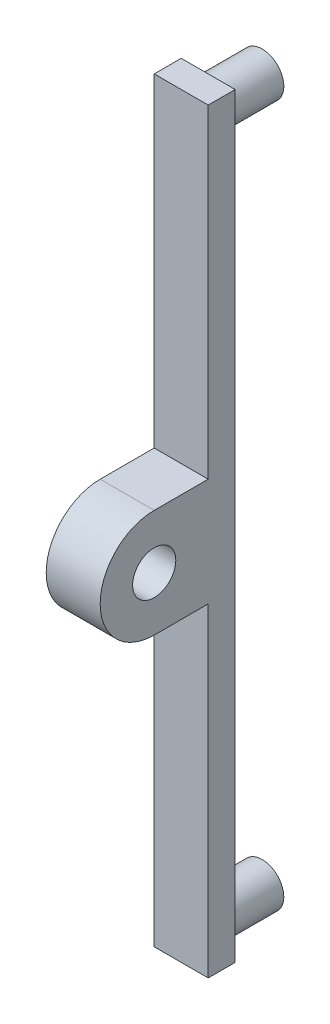
ISO-10303-21;
HEADER;
FILE_DESCRIPTION(('STEP AP214'),'2;1');
FILE_NAME('part.step','',(''),(''),'','','');
FILE_SCHEMA(('AUTOMOTIVE_DESIGN { 1 0 10303 214 1 1 1 1 }'));
ENDSEC;
DATA;
#1=APPLICATION_CONTEXT('core data for automotive mechanical design processes');
#2=APPLICATION_PROTOCOL_DEFINITION('international standard','automotive_design',2000,#1);
#3=PRODUCT_CONTEXT('',#1,'mechanical');
#4=PRODUCT('Part','Part','',(#3));
#5=PRODUCT_RELATED_PRODUCT_CATEGORY('part','',(#4));
#6=PRODUCT_DEFINITION_FORMATION('','',#4);
#7=PRODUCT_DEFINITION_CONTEXT('part definition',#1,'design');
#8=PRODUCT_DEFINITION('design','',#6,#7);
#9=PRODUCT_DEFINITION_SHAPE('','',#8);
#10=(LENGTH_UNIT() NAMED_UNIT(*) SI_UNIT(.MILLI.,.METRE.));
#11=(NAMED_UNIT(*) PLANE_ANGLE_UNIT() SI_UNIT($,.RADIAN.));
#12=(NAMED_UNIT(*) SI_UNIT($,.STERADIAN.) SOLID_ANGLE_UNIT());
#13=UNCERTAINTY_MEASURE_WITH_UNIT(LENGTH_MEASURE(1.E-05),#10,'distance_accuracy_value','');
#14=(GEOMETRIC_REPRESENTATION_CONTEXT(3) GLOBAL_UNCERTAINTY_ASSIGNED_CONTEXT((#13)) GLOBAL_UNIT_ASSIGNED_CONTEXT((#10,
#11,#12)) REPRESENTATION_CONTEXT('',''));
#15=CARTESIAN_POINT('',(0.,0.,0.));
#16=DIRECTION('',(0.,0.,1.));
#17=DIRECTION('',(1.,0.,0.));
#18=AXIS2_PLACEMENT_3D('',#15,#16,#17);
#19=CARTESIAN_POINT('',(10.,10.,0.));
#20=DIRECTION('',(0.,1.,0.));
#21=DIRECTION('',(0.,0.,1.));
#22=AXIS2_PLACEMENT_3D('',#19,#20,#21);
#23=PLANE('',#22);
#24=DIRECTION('',(0.,0.,-1.));
#25=VECTOR('',#24,1.);
#26=CARTESIAN_POINT('',(0.,10.,0.));
#27=LINE('',#26,#25);
#28=CARTESIAN_POINT('',(0.,10.,0.));
#29=VERTEX_POINT('',#28);
#30=CARTESIAN_POINT('',(0.,10.,-10.));
#31=VERTEX_POINT('',#30);
#32=EDGE_CURVE('E132',#29,#31,#27,.T.);
#33=ORIENTED_EDGE('',*,*,#32,.F.);
#34=DIRECTION('',(-1.,0.,0.));
#35=VECTOR('',#34,1.);
#36=CARTESIAN_POINT('',(10.,10.,0.));
#37=LINE('',#36,#35);
#38=CARTESIAN_POINT('',(10.,10.,0.));
#39=VERTEX_POINT('',#38);
#40=EDGE_CURVE('E11',#39,#29,#37,.T.);
#41=ORIENTED_EDGE('',*,*,#40,.F.);
#42=DIRECTION('',(0.,0.,-1.));
#43=VECTOR('',#42,1.);
#44=CARTESIAN_POINT('',(10.,10.,0.));
#45=LINE('',#44,#43);
#46=CARTESIAN_POINT('',(10.,10.,-10.));
#47=VERTEX_POINT('',#46);
#48=EDGE_CURVE('E237',#39,#47,#45,.T.);
#49=ORIENTED_EDGE('',*,*,#48,.T.);
#50=DIRECTION('',(-1.,0.,0.));
#51=VECTOR('',#50,1.);
#52=CARTESIAN_POINT('',(10.,10.,-10.));
#53=LINE('',#52,#51);
#54=EDGE_CURVE('E86',#47,#31,#53,.T.);
#55=ORIENTED_EDGE('',*,*,#54,.T.);
#56=EDGE_LOOP('',(#33,#41,#49,#55));
#57=FACE_BOUND('',#56,.T.);
#58=ADVANCED_FACE('F35',(#57),#23,.T.);
#59=CARTESIAN_POINT('',(10.,0.,0.));
#60=DIRECTION('',(-1.,0.,0.));
#61=DIRECTION('',(0.,0.,1.));
#62=AXIS2_PLACEMENT_3D('',#59,#60,#61);
#63=CYLINDRICAL_SURFACE('',#62,10.);
#64=CARTESIAN_POINT('',(0.,0.,0.));
#65=DIRECTION('',(1.,0.,0.));
#66=DIRECTION('',(0.,0.,-1.));
#67=AXIS2_PLACEMENT_3D('',#64,#65,#66);
#68=CIRCLE('',#67,10.);
#69=CARTESIAN_POINT('',(0.,-10.,0.));
#70=VERTEX_POINT('',#69);
#71=EDGE_CURVE('E136',#29,#70,#68,.T.);
#72=ORIENTED_EDGE('',*,*,#71,.T.);
#73=DIRECTION('',(-1.,0.,0.));
#74=VECTOR('',#73,1.);
#75=CARTESIAN_POINT('',(10.,-10.,0.));
#76=LINE('',#75,#74);
#77=CARTESIAN_POINT('',(10.,-10.,0.));
#78=VERTEX_POINT('',#77);
#79=EDGE_CURVE('E44',#78,#70,#76,.T.);
#80=ORIENTED_EDGE('',*,*,#79,.F.);
#81=CARTESIAN_POINT('',(10.,0.,0.));
#82=DIRECTION('',(1.,0.,0.));
#83=DIRECTION('',(0.,0.,-1.));
#84=AXIS2_PLACEMENT_3D('',#81,#82,#83);
#85=CIRCLE('',#84,10.);
#86=EDGE_CURVE('E239',#39,#78,#85,.T.);
#87=ORIENTED_EDGE('',*,*,#86,.F.);
#88=ORIENTED_EDGE('',*,*,#40,.T.);
#89=EDGE_LOOP('',(#72,#80,#87,#88));
#90=FACE_BOUND('',#89,.T.);
#91=ADVANCED_FACE('F172',(#90),#63,.T.);
#92=CARTESIAN_POINT('',(10.,-10.,0.));
#93=DIRECTION('',(0.,1.,0.));
#94=DIRECTION('',(0.,0.,1.));
#95=AXIS2_PLACEMENT_3D('',#92,#93,#94);
#96=PLANE('',#95);
#97=DIRECTION('',(0.,0.,-1.));
#98=VECTOR('',#97,1.);
#99=CARTESIAN_POINT('',(0.,-10.,0.));
#100=LINE('',#99,#98);
#101=CARTESIAN_POINT('',(0.,-10.,-10.));
#102=VERTEX_POINT('',#101);
#103=EDGE_CURVE('E139',#70,#102,#100,.T.);
#104=ORIENTED_EDGE('',*,*,#103,.T.);
#105=DIRECTION('',(-1.,0.,0.));
#106=VECTOR('',#105,1.);
#107=CARTESIAN_POINT('',(10.,-10.,-10.));
#108=LINE('',#107,#106);
#109=CARTESIAN_POINT('',(10.,-10.,-10.));
#110=VERTEX_POINT('',#109);
#111=EDGE_CURVE('E160',#110,#102,#108,.T.);
#112=ORIENTED_EDGE('',*,*,#111,.F.);
#113=DIRECTION('',(0.,0.,-1.));
#114=VECTOR('',#113,1.);
#115=CARTESIAN_POINT('',(10.,-10.,0.));
#116=LINE('',#115,#114);
#117=EDGE_CURVE('E168',#78,#110,#116,.T.);
#118=ORIENTED_EDGE('',*,*,#117,.F.);
#119=ORIENTED_EDGE('',*,*,#79,.T.);
#120=EDGE_LOOP('',(#104,#112,#118,#119));
#121=FACE_BOUND('',#120,.T.);
#122=ADVANCED_FACE('F165',(#121),#96,.F.);
#123=CARTESIAN_POINT('',(10.,0.,-10.));
#124=DIRECTION('',(0.,0.,-1.));
#125=DIRECTION('',(-1.,0.,0.));
#126=AXIS2_PLACEMENT_3D('',#123,#124,#125);
#127=PLANE('',#126);
#128=DIRECTION('',(0.,-1.,0.));
#129=VECTOR('',#128,1.);
#130=CARTESIAN_POINT('',(0.,0.,-10.));
#131=LINE('',#130,#129);
#132=CARTESIAN_POINT('',(0.,-70.,-10.));
#133=VERTEX_POINT('',#132);
#134=EDGE_CURVE('E142',#102,#133,#131,.T.);
#135=ORIENTED_EDGE('',*,*,#134,.T.);
#136=DIRECTION('',(-1.,0.,0.));
#137=VECTOR('',#136,1.);
#138=CARTESIAN_POINT('',(10.,-70.,-10.));
#139=LINE('',#138,#137);
#140=CARTESIAN_POINT('',(10.,-70.,-10.));
#141=VERTEX_POINT('',#140);
#142=EDGE_CURVE('E157',#141,#133,#139,.T.);
#143=ORIENTED_EDGE('',*,*,#142,.F.);
#144=DIRECTION('',(0.,-1.,0.));
#145=VECTOR('',#144,1.);
#146=CARTESIAN_POINT('',(10.,0.,-10.));
#147=LINE('',#146,#145);
#148=EDGE_CURVE('E242',#110,#141,#147,.T.);
#149=ORIENTED_EDGE('',*,*,#148,.F.);
#150=ORIENTED_EDGE('',*,*,#111,.T.);
#151=EDGE_LOOP('',(#135,#143,#149,#150));
#152=FACE_BOUND('',#151,.T.);
#153=ADVANCED_FACE('F183',(#152),#127,.F.);
#154=CARTESIAN_POINT('',(10.,-70.,0.));
#155=DIRECTION('',(0.,1.,0.));
#156=DIRECTION('',(0.,0.,1.));
#157=AXIS2_PLACEMENT_3D('',#154,#155,#156);
#158=PLANE('',#157);
#159=DIRECTION('',(0.,0.,-1.));
#160=VECTOR('',#159,1.);
#161=CARTESIAN_POINT('',(0.,-70.,0.));
#162=LINE('',#161,#160);
#163=CARTESIAN_POINT('',(0.,-70.,-15.));
#164=VERTEX_POINT('',#163);
#165=EDGE_CURVE('E145',#133,#164,#162,.T.);
#166=ORIENTED_EDGE('',*,*,#165,.T.);
#167=DIRECTION('',(-1.,0.,0.));
#168=VECTOR('',#167,1.);
#169=CARTESIAN_POINT('',(10.,-70.,-15.));
#170=LINE('',#169,#168);
#171=CARTESIAN_POINT('',(10.,-70.,-15.));
#172=VERTEX_POINT('',#171);
#173=EDGE_CURVE('E116',#172,#164,#170,.T.);
#174=ORIENTED_EDGE('',*,*,#173,.F.);
#175=DIRECTION('',(0.,0.,-1.));
#176=VECTOR('',#175,1.);
#177=CARTESIAN_POINT('',(10.,-70.,0.));
#178=LINE('',#177,#176);
#179=EDGE_CURVE('E121',#141,#172,#178,.T.);
#180=ORIENTED_EDGE('',*,*,#179,.F.);
#181=ORIENTED_EDGE('',*,*,#142,.T.);
#182=EDGE_LOOP('',(#166,#174,#180,#181));
#183=FACE_BOUND('',#182,.T.);
#184=ADVANCED_FACE('F186',(#183),#158,.F.);
#185=CARTESIAN_POINT('',(10.,0.,-15.));
#186=DIRECTION('',(0.,0.,-1.));
#187=DIRECTION('',(0.,1.,0.));
#188=AXIS2_PLACEMENT_3D('',#185,#186,#187);
#189=PLANE('',#188);
#190=CARTESIAN_POINT('',(4.99999999999998,-65.,-15.));
#191=DIRECTION('',(0.,0.,-1.));
#192=DIRECTION('',(1.,0.,0.));
#193=AXIS2_PLACEMENT_3D('',#190,#191,#192);
#194=CIRCLE('',#193,4.);
#195=CARTESIAN_POINT('',(8.99999999999999,-65.,-15.));
#196=VERTEX_POINT('',#195);
#197=EDGE_CURVE('E226',#196,#196,#194,.T.);
#198=ORIENTED_EDGE('',*,*,#197,.F.);
#199=EDGE_LOOP('',(#198));
#200=FACE_BOUND('',#199,.T.);
#201=CARTESIAN_POINT('',(5.,65.,-15.));
#202=DIRECTION('',(0.,0.,-1.));
#203=DIRECTION('',(-1.,0.,0.));
#204=AXIS2_PLACEMENT_3D('',#201,#202,#203);
#205=CIRCLE('',#204,4.);
#206=CARTESIAN_POINT('',(0.999999999999996,65.,-15.));
#207=VERTEX_POINT('',#206);
#208=EDGE_CURVE('E225',#207,#207,#205,.T.);
#209=ORIENTED_EDGE('',*,*,#208,.F.);
#210=EDGE_LOOP('',(#209));
#211=FACE_BOUND('',#210,.T.);
#212=DIRECTION('',(0.,-1.,0.));
#213=VECTOR('',#212,1.);
#214=CARTESIAN_POINT('',(0.,0.,-15.));
#215=LINE('',#214,#213);
#216=CARTESIAN_POINT('',(0.,70.,-15.));
#217=VERTEX_POINT('',#216);
#218=EDGE_CURVE('E111',#217,#164,#215,.T.);
#219=ORIENTED_EDGE('',*,*,#218,.F.);
#220=DIRECTION('',(-1.,0.,0.));
#221=VECTOR('',#220,1.);
#222=CARTESIAN_POINT('',(10.,70.,-15.));
#223=LINE('',#222,#221);
#224=CARTESIAN_POINT('',(10.,70.,-15.));
#225=VERTEX_POINT('',#224);
#226=EDGE_CURVE('E106',#225,#217,#223,.T.);
#227=ORIENTED_EDGE('',*,*,#226,.F.);
#228=DIRECTION('',(0.,-1.,0.));
#229=VECTOR('',#228,1.);
#230=CARTESIAN_POINT('',(10.,0.,-15.));
#231=LINE('',#230,#229);
#232=EDGE_CURVE('E109',#225,#172,#231,.T.);
#233=ORIENTED_EDGE('',*,*,#232,.T.);
#234=ORIENTED_EDGE('',*,*,#173,.T.);
#235=EDGE_LOOP('',(#219,#227,#233,#234));
#236=FACE_BOUND('',#235,.T.);
#237=ADVANCED_FACE('F108',(#200,#211,#236),#189,.T.);
#238=CARTESIAN_POINT('',(10.,70.,0.));
#239=DIRECTION('',(0.,1.,0.));
#240=DIRECTION('',(0.,0.,1.));
#241=AXIS2_PLACEMENT_3D('',#238,#239,#240);
#242=PLANE('',#241);
#243=DIRECTION('',(0.,0.,-1.));
#244=VECTOR('',#243,1.);
#245=CARTESIAN_POINT('',(0.,70.,0.));
#246=LINE('',#245,#244);
#247=CARTESIAN_POINT('',(0.,70.,-10.));
#248=VERTEX_POINT('',#247);
#249=EDGE_CURVE('E149',#248,#217,#246,.T.);
#250=ORIENTED_EDGE('',*,*,#249,.F.);
#251=DIRECTION('',(-1.,0.,0.));
#252=VECTOR('',#251,1.);
#253=CARTESIAN_POINT('',(10.,70.,-10.));
#254=LINE('',#253,#252);
#255=CARTESIAN_POINT('',(10.,70.,-10.));
#256=VERTEX_POINT('',#255);
#257=EDGE_CURVE('E79',#256,#248,#254,.T.);
#258=ORIENTED_EDGE('',*,*,#257,.F.);
#259=DIRECTION('',(0.,0.,-1.));
#260=VECTOR('',#259,1.);
#261=CARTESIAN_POINT('',(10.,70.,0.));
#262=LINE('',#261,#260);
#263=EDGE_CURVE('E119',#256,#225,#262,.T.);
#264=ORIENTED_EDGE('',*,*,#263,.T.);
#265=ORIENTED_EDGE('',*,*,#226,.T.);
#266=EDGE_LOOP('',(#250,#258,#264,#265));
#267=FACE_BOUND('',#266,.T.);
#268=ADVANCED_FACE('F124',(#267),#242,.T.);
#269=CARTESIAN_POINT('',(10.,0.,0.));
#270=DIRECTION('',(-1.,0.,0.));
#271=DIRECTION('',(0.,0.,1.));
#272=AXIS2_PLACEMENT_3D('',#269,#270,#271);
#273=CYLINDRICAL_SURFACE('',#272,4.);
#274=CARTESIAN_POINT('',(10.,0.,0.));
#275=DIRECTION('',(1.,0.,0.));
#276=DIRECTION('',(0.,0.,-1.));
#277=AXIS2_PLACEMENT_3D('',#274,#275,#276);
#278=CIRCLE('',#277,4.);
#279=CARTESIAN_POINT('',(10.,0.,-4.));
#280=VERTEX_POINT('',#279);
#281=EDGE_CURVE('E153',#280,#280,#278,.T.);
#282=ORIENTED_EDGE('',*,*,#281,.T.);
#283=EDGE_LOOP('',(#282));
#284=FACE_BOUND('',#283,.T.);
#285=CARTESIAN_POINT('',(0.,0.,0.));
#286=DIRECTION('',(1.,0.,0.));
#287=DIRECTION('',(0.,0.,-1.));
#288=AXIS2_PLACEMENT_3D('',#285,#286,#287);
#289=CIRCLE('',#288,4.);
#290=CARTESIAN_POINT('',(0.,0.,-4.));
#291=VERTEX_POINT('',#290);
#292=EDGE_CURVE('E129',#291,#291,#289,.T.);
#293=ORIENTED_EDGE('',*,*,#292,.F.);
#294=EDGE_LOOP('',(#293));
#295=FACE_BOUND('',#294,.T.);
#296=ADVANCED_FACE('F37',(#284,#295),#273,.F.);
#297=CARTESIAN_POINT('',(10.,0.,-10.));
#298=DIRECTION('',(0.,0.,-1.));
#299=DIRECTION('',(-1.,0.,0.));
#300=AXIS2_PLACEMENT_3D('',#297,#298,#299);
#301=PLANE('',#300);
#302=DIRECTION('',(0.,-1.,0.));
#303=VECTOR('',#302,1.);
#304=CARTESIAN_POINT('',(0.,0.,-10.));
#305=LINE('',#304,#303);
#306=EDGE_CURVE('E151',#248,#31,#305,.T.);
#307=ORIENTED_EDGE('',*,*,#306,.T.);
#308=ORIENTED_EDGE('',*,*,#54,.F.);
#309=DIRECTION('',(0.,-1.,0.));
#310=VECTOR('',#309,1.);
#311=CARTESIAN_POINT('',(10.,0.,-10.));
#312=LINE('',#311,#310);
#313=EDGE_CURVE('E52',#256,#47,#312,.T.);
#314=ORIENTED_EDGE('',*,*,#313,.F.);
#315=ORIENTED_EDGE('',*,*,#257,.T.);
#316=EDGE_LOOP('',(#307,#308,#314,#315));
#317=FACE_BOUND('',#316,.T.);
#318=ADVANCED_FACE('F196',(#317),#301,.F.);
#319=CARTESIAN_POINT('',(10.,0.,0.));
#320=DIRECTION('',(1.,0.,0.));
#321=DIRECTION('',(0.,0.,-1.));
#322=AXIS2_PLACEMENT_3D('',#319,#320,#321);
#323=PLANE('',#322);
#324=ORIENTED_EDGE('',*,*,#281,.F.);
#325=EDGE_LOOP('',(#324));
#326=FACE_BOUND('',#325,.T.);
#327=ORIENTED_EDGE('',*,*,#48,.F.);
#328=ORIENTED_EDGE('',*,*,#86,.T.);
#329=ORIENTED_EDGE('',*,*,#117,.T.);
#330=ORIENTED_EDGE('',*,*,#148,.T.);
#331=ORIENTED_EDGE('',*,*,#179,.T.);
#332=ORIENTED_EDGE('',*,*,#232,.F.);
#333=ORIENTED_EDGE('',*,*,#263,.F.);
#334=ORIENTED_EDGE('',*,*,#313,.T.);
#335=EDGE_LOOP('',(#327,#328,#329,#330,#331,#332,#333,#334));
#336=FACE_BOUND('',#335,.T.);
#337=ADVANCED_FACE('F118',(#326,#336),#323,.T.);
#338=CARTESIAN_POINT('',(0.,0.,0.));
#339=DIRECTION('',(1.,0.,0.));
#340=DIRECTION('',(0.,0.,-1.));
#341=AXIS2_PLACEMENT_3D('',#338,#339,#340);
#342=PLANE('',#341);
#343=ORIENTED_EDGE('',*,*,#292,.T.);
#344=EDGE_LOOP('',(#343));
#345=FACE_BOUND('',#344,.T.);
#346=ORIENTED_EDGE('',*,*,#32,.T.);
#347=ORIENTED_EDGE('',*,*,#306,.F.);
#348=ORIENTED_EDGE('',*,*,#249,.T.);
#349=ORIENTED_EDGE('',*,*,#218,.T.);
#350=ORIENTED_EDGE('',*,*,#165,.F.);
#351=ORIENTED_EDGE('',*,*,#134,.F.);
#352=ORIENTED_EDGE('',*,*,#103,.F.);
#353=ORIENTED_EDGE('',*,*,#71,.F.);
#354=EDGE_LOOP('',(#346,#347,#348,#349,#350,#351,#352,#353));
#355=FACE_BOUND('',#354,.T.);
#356=ADVANCED_FACE('F174',(#345,#355),#342,.F.);
#357=CARTESIAN_POINT('',(5.,65.,-25.));
#358=DIRECTION('',(0.,0.,1.));
#359=DIRECTION('',(1.,0.,0.));
#360=AXIS2_PLACEMENT_3D('',#357,#358,#359);
#361=CYLINDRICAL_SURFACE('',#360,4.);
#362=CARTESIAN_POINT('',(5.,65.,-25.));
#363=DIRECTION('',(0.,0.,-1.));
#364=DIRECTION('',(-1.,0.,0.));
#365=AXIS2_PLACEMENT_3D('',#362,#363,#364);
#366=CIRCLE('',#365,4.);
#367=CARTESIAN_POINT('',(0.999999999999996,65.,-25.));
#368=VERTEX_POINT('',#367);
#369=EDGE_CURVE('E133',#368,#368,#366,.T.);
#370=ORIENTED_EDGE('',*,*,#369,.F.);
#371=EDGE_LOOP('',(#370));
#372=FACE_BOUND('',#371,.T.);
#373=ORIENTED_EDGE('',*,*,#208,.T.);
#374=EDGE_LOOP('',(#373));
#375=FACE_BOUND('',#374,.T.);
#376=ADVANCED_FACE('F201',(#372,#375),#361,.T.);
#377=CARTESIAN_POINT('',(5.,65.,-25.));
#378=DIRECTION('',(0.,0.,-1.));
#379=DIRECTION('',(-1.,0.,0.));
#380=AXIS2_PLACEMENT_3D('',#377,#378,#379);
#381=PLANE('',#380);
#382=ORIENTED_EDGE('',*,*,#369,.T.);
#383=EDGE_LOOP('',(#382));
#384=FACE_BOUND('',#383,.T.);
#385=ADVANCED_FACE('F208',(#384),#381,.T.);
#386=CARTESIAN_POINT('',(4.99999999999998,-65.,-25.));
#387=DIRECTION('',(0.,0.,1.));
#388=DIRECTION('',(1.,0.,0.));
#389=AXIS2_PLACEMENT_3D('',#386,#387,#388);
#390=CYLINDRICAL_SURFACE('',#389,4.);
#391=CARTESIAN_POINT('',(4.99999999999998,-65.,-25.));
#392=DIRECTION('',(0.,0.,-1.));
#393=DIRECTION('',(1.,0.,0.));
#394=AXIS2_PLACEMENT_3D('',#391,#392,#393);
#395=CIRCLE('',#394,4.);
#396=CARTESIAN_POINT('',(8.99999999999999,-65.,-25.));
#397=VERTEX_POINT('',#396);
#398=EDGE_CURVE('E224',#397,#397,#395,.T.);
#399=ORIENTED_EDGE('',*,*,#398,.F.);
#400=EDGE_LOOP('',(#399));
#401=FACE_BOUND('',#400,.T.);
#402=ORIENTED_EDGE('',*,*,#197,.T.);
#403=EDGE_LOOP('',(#402));
#404=FACE_BOUND('',#403,.T.);
#405=ADVANCED_FACE('F212',(#401,#404),#390,.T.);
#406=CARTESIAN_POINT('',(4.99999999999998,-65.,-25.));
#407=DIRECTION('',(0.,0.,1.));
#408=DIRECTION('',(1.,0.,0.));
#409=AXIS2_PLACEMENT_3D('',#406,#407,#408);
#410=PLANE('',#409);
#411=ORIENTED_EDGE('',*,*,#398,.T.);
#412=EDGE_LOOP('',(#411));
#413=FACE_BOUND('',#412,.T.);
#414=ADVANCED_FACE('F216',(#413),#410,.F.);
#415=CLOSED_SHELL('',(#58,#91,#122,#153,#184,#237,#268,#296,#318,#337,#356,#376,#385,#405,#414));
#416=MANIFOLD_SOLID_BREP('B2',#415);
#417=ADVANCED_BREP_SHAPE_REPRESENTATION('',(#18,#416),#14);
#418=SHAPE_DEFINITION_REPRESENTATION(#9,#417);
ENDSEC;
END-ISO-10303-21;
